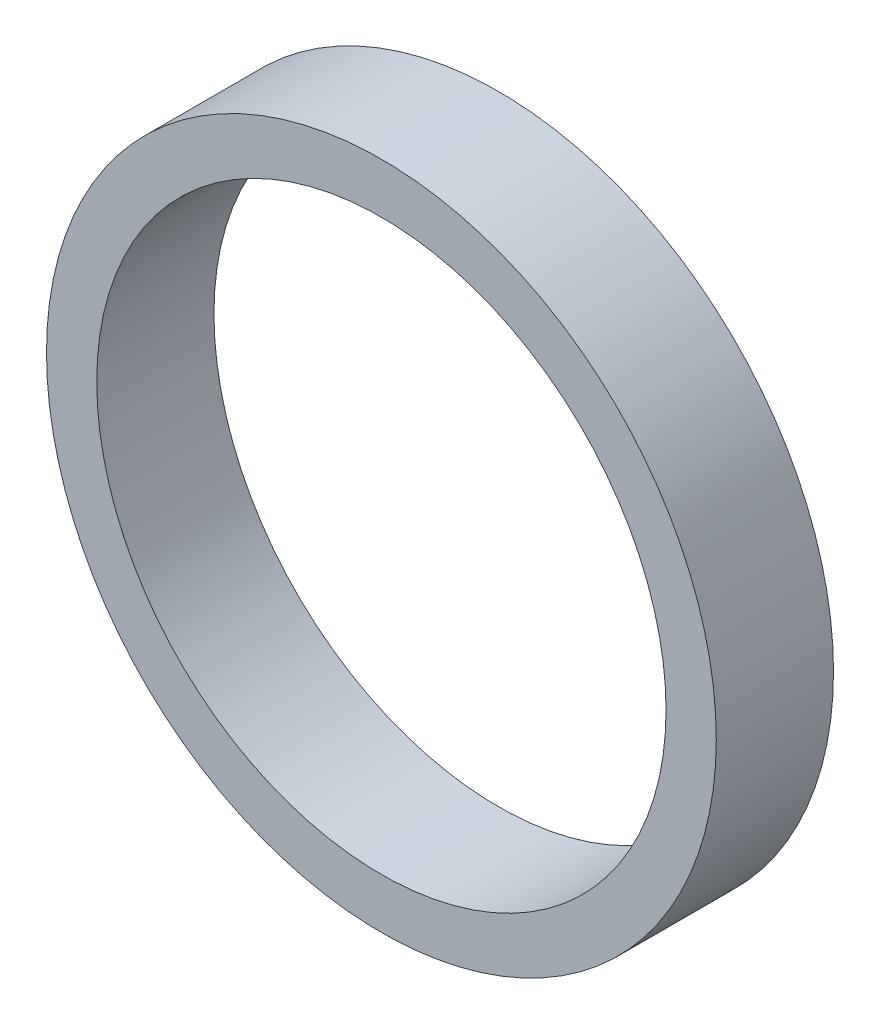
ISO-10303-21;
HEADER;
FILE_DESCRIPTION(('STEP AP214'),'2;1');
FILE_NAME('part.step','',(''),(''),'','','');
FILE_SCHEMA(('AUTOMOTIVE_DESIGN { 1 0 10303 214 1 1 1 1 }'));
ENDSEC;
DATA;
#1=APPLICATION_CONTEXT('core data for automotive mechanical design processes');
#2=APPLICATION_PROTOCOL_DEFINITION('international standard','automotive_design',2000,#1);
#3=PRODUCT_CONTEXT('',#1,'mechanical');
#4=PRODUCT('Part','Part','',(#3));
#5=PRODUCT_RELATED_PRODUCT_CATEGORY('part','',(#4));
#6=PRODUCT_DEFINITION_FORMATION('','',#4);
#7=PRODUCT_DEFINITION_CONTEXT('part definition',#1,'design');
#8=PRODUCT_DEFINITION('design','',#6,#7);
#9=PRODUCT_DEFINITION_SHAPE('','',#8);
#10=(LENGTH_UNIT() NAMED_UNIT(*) SI_UNIT(.MILLI.,.METRE.));
#11=(NAMED_UNIT(*) PLANE_ANGLE_UNIT() SI_UNIT($,.RADIAN.));
#12=(NAMED_UNIT(*) SI_UNIT($,.STERADIAN.) SOLID_ANGLE_UNIT());
#13=UNCERTAINTY_MEASURE_WITH_UNIT(LENGTH_MEASURE(1.E-05),#10,'distance_accuracy_value','');
#14=(GEOMETRIC_REPRESENTATION_CONTEXT(3) GLOBAL_UNCERTAINTY_ASSIGNED_CONTEXT((#13)) GLOBAL_UNIT_ASSIGNED_CONTEXT((#10,
#11,#12)) REPRESENTATION_CONTEXT('',''));
#15=CARTESIAN_POINT('',(0.,0.,0.));
#16=DIRECTION('',(0.,0.,1.));
#17=DIRECTION('',(1.,0.,0.));
#18=AXIS2_PLACEMENT_3D('',#15,#16,#17);
#19=CARTESIAN_POINT('',(0.,0.,7.));
#20=DIRECTION('',(0.,0.,1.));
#21=DIRECTION('',(1.,0.,0.));
#22=AXIS2_PLACEMENT_3D('',#19,#20,#21);
#23=PLANE('',#22);
#24=CARTESIAN_POINT('',(0.,0.,7.));
#25=DIRECTION('',(0.,0.,1.));
#26=DIRECTION('',(1.,0.,0.));
#27=AXIS2_PLACEMENT_3D('',#24,#25,#26);
#28=CIRCLE('',#27,20.);
#29=CARTESIAN_POINT('',(20.,0.,7.));
#30=VERTEX_POINT('',#29);
#31=EDGE_CURVE('E10',#30,#30,#28,.T.);
#32=ORIENTED_EDGE('',*,*,#31,.T.);
#33=EDGE_LOOP('',(#32));
#34=FACE_BOUND('',#33,.T.);
#35=CARTESIAN_POINT('',(0.,0.,7.));
#36=DIRECTION('',(0.,0.,1.));
#37=DIRECTION('',(1.,0.,0.));
#38=AXIS2_PLACEMENT_3D('',#35,#36,#37);
#39=CIRCLE('',#38,17.);
#40=CARTESIAN_POINT('',(17.,0.,7.));
#41=VERTEX_POINT('',#40);
#42=EDGE_CURVE('E46',#41,#41,#39,.T.);
#43=ORIENTED_EDGE('',*,*,#42,.F.);
#44=EDGE_LOOP('',(#43));
#45=FACE_BOUND('',#44,.T.);
#46=ADVANCED_FACE('F35',(#34,#45),#23,.T.);
#47=CARTESIAN_POINT('',(0.,0.,0.));
#48=DIRECTION('',(0.,0.,1.));
#49=DIRECTION('',(1.,0.,0.));
#50=AXIS2_PLACEMENT_3D('',#47,#48,#49);
#51=PLANE('',#50);
#52=CARTESIAN_POINT('',(0.,0.,0.));
#53=DIRECTION('',(0.,0.,1.));
#54=DIRECTION('',(1.,0.,0.));
#55=AXIS2_PLACEMENT_3D('',#52,#53,#54);
#56=CIRCLE('',#55,20.);
#57=CARTESIAN_POINT('',(20.,0.,0.));
#58=VERTEX_POINT('',#57);
#59=EDGE_CURVE('E39',#58,#58,#56,.T.);
#60=ORIENTED_EDGE('',*,*,#59,.F.);
#61=EDGE_LOOP('',(#60));
#62=FACE_BOUND('',#61,.T.);
#63=CARTESIAN_POINT('',(0.,0.,0.));
#64=DIRECTION('',(0.,0.,1.));
#65=DIRECTION('',(1.,0.,0.));
#66=AXIS2_PLACEMENT_3D('',#63,#64,#65);
#67=CIRCLE('',#66,17.);
#68=CARTESIAN_POINT('',(17.,0.,0.));
#69=VERTEX_POINT('',#68);
#70=EDGE_CURVE('E48',#69,#69,#67,.T.);
#71=ORIENTED_EDGE('',*,*,#70,.T.);
#72=EDGE_LOOP('',(#71));
#73=FACE_BOUND('',#72,.T.);
#74=ADVANCED_FACE('F58',(#62,#73),#51,.F.);
#75=CARTESIAN_POINT('',(0.,0.,7.));
#76=DIRECTION('',(0.,0.,-1.));
#77=DIRECTION('',(-1.,0.,0.));
#78=AXIS2_PLACEMENT_3D('',#75,#76,#77);
#79=CYLINDRICAL_SURFACE('',#78,20.);
#80=ORIENTED_EDGE('',*,*,#31,.F.);
#81=EDGE_LOOP('',(#80));
#82=FACE_BOUND('',#81,.T.);
#83=ORIENTED_EDGE('',*,*,#59,.T.);
#84=EDGE_LOOP('',(#83));
#85=FACE_BOUND('',#84,.T.);
#86=ADVANCED_FACE('F37',(#82,#85),#79,.T.);
#87=CARTESIAN_POINT('',(0.,0.,7.));
#88=DIRECTION('',(0.,0.,-1.));
#89=DIRECTION('',(-1.,0.,0.));
#90=AXIS2_PLACEMENT_3D('',#87,#88,#89);
#91=CYLINDRICAL_SURFACE('',#90,17.);
#92=ORIENTED_EDGE('',*,*,#42,.T.);
#93=EDGE_LOOP('',(#92));
#94=FACE_BOUND('',#93,.T.);
#95=ORIENTED_EDGE('',*,*,#70,.F.);
#96=EDGE_LOOP('',(#95));
#97=FACE_BOUND('',#96,.T.);
#98=ADVANCED_FACE('F54',(#94,#97),#91,.F.);
#99=CLOSED_SHELL('',(#46,#74,#86,#98));
#100=MANIFOLD_SOLID_BREP('B2',#99);
#101=ADVANCED_BREP_SHAPE_REPRESENTATION('',(#18,#100),#14);
#102=SHAPE_DEFINITION_REPRESENTATION(#9,#101);
ENDSEC;
END-ISO-10303-21;
